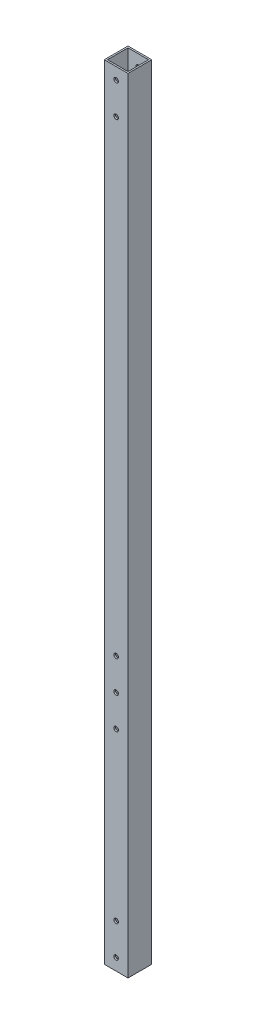
ISO-10303-21;
HEADER;
FILE_DESCRIPTION(('STEP AP214'),'2;1');
FILE_NAME('part.step','',(''),(''),'','','');
FILE_SCHEMA(('AUTOMOTIVE_DESIGN { 1 0 10303 214 1 1 1 1 }'));
ENDSEC;
DATA;
#1=APPLICATION_CONTEXT('core data for automotive mechanical design processes');
#2=APPLICATION_PROTOCOL_DEFINITION('international standard','automotive_design',2000,#1);
#3=PRODUCT_CONTEXT('',#1,'mechanical');
#4=PRODUCT('Part','Part','',(#3));
#5=PRODUCT_RELATED_PRODUCT_CATEGORY('part','',(#4));
#6=PRODUCT_DEFINITION_FORMATION('','',#4);
#7=PRODUCT_DEFINITION_CONTEXT('part definition',#1,'design');
#8=PRODUCT_DEFINITION('design','',#6,#7);
#9=PRODUCT_DEFINITION_SHAPE('','',#8);
#10=(LENGTH_UNIT() NAMED_UNIT(*) SI_UNIT(.MILLI.,.METRE.));
#11=(NAMED_UNIT(*) PLANE_ANGLE_UNIT() SI_UNIT($,.RADIAN.));
#12=(NAMED_UNIT(*) SI_UNIT($,.STERADIAN.) SOLID_ANGLE_UNIT());
#13=UNCERTAINTY_MEASURE_WITH_UNIT(LENGTH_MEASURE(1.E-05),#10,'distance_accuracy_value','');
#14=(GEOMETRIC_REPRESENTATION_CONTEXT(3) GLOBAL_UNCERTAINTY_ASSIGNED_CONTEXT((#13)) GLOBAL_UNIT_ASSIGNED_CONTEXT((#10,
#11,#12)) REPRESENTATION_CONTEXT('',''));
#15=CARTESIAN_POINT('',(0.,0.,0.));
#16=DIRECTION('',(0.,0.,1.));
#17=DIRECTION('',(1.,0.,0.));
#18=AXIS2_PLACEMENT_3D('',#15,#16,#17);
#19=CARTESIAN_POINT('',(0.,495.,0.));
#20=DIRECTION('',(0.,1.,0.));
#21=DIRECTION('',(0.,0.,1.));
#22=AXIS2_PLACEMENT_3D('',#19,#20,#21);
#23=PLANE('',#22);
#24=DIRECTION('',(0.,0.,-1.));
#25=VECTOR('',#24,1.);
#26=CARTESIAN_POINT('',(7.5,495.,7.5));
#27=LINE('',#26,#25);
#28=CARTESIAN_POINT('',(7.5,495.,7.5));
#29=VERTEX_POINT('',#28);
#30=CARTESIAN_POINT('',(7.5,495.,-7.5));
#31=VERTEX_POINT('',#30);
#32=EDGE_CURVE('E194',#29,#31,#27,.T.);
#33=ORIENTED_EDGE('',*,*,#32,.T.);
#34=DIRECTION('',(-1.,0.,0.));
#35=VECTOR('',#34,1.);
#36=CARTESIAN_POINT('',(-7.5,495.,-7.5));
#37=LINE('',#36,#35);
#38=CARTESIAN_POINT('',(-7.5,495.,-7.5));
#39=VERTEX_POINT('',#38);
#40=EDGE_CURVE('E198',#31,#39,#37,.T.);
#41=ORIENTED_EDGE('',*,*,#40,.T.);
#42=DIRECTION('',(0.,0.,1.));
#43=VECTOR('',#42,1.);
#44=CARTESIAN_POINT('',(-7.5,495.,7.5));
#45=LINE('',#44,#43);
#46=CARTESIAN_POINT('',(-7.5,495.,7.5));
#47=VERTEX_POINT('',#46);
#48=EDGE_CURVE('E202',#39,#47,#45,.T.);
#49=ORIENTED_EDGE('',*,*,#48,.T.);
#50=DIRECTION('',(1.,0.,0.));
#51=VECTOR('',#50,1.);
#52=CARTESIAN_POINT('',(-7.5,495.,7.5));
#53=LINE('',#52,#51);
#54=EDGE_CURVE('E205',#47,#29,#53,.T.);
#55=ORIENTED_EDGE('',*,*,#54,.T.);
#56=EDGE_LOOP('',(#33,#41,#49,#55));
#57=FACE_BOUND('',#56,.T.);
#58=DIRECTION('',(-1.,0.,0.));
#59=VECTOR('',#58,1.);
#60=CARTESIAN_POINT('',(0.,495.,-6.5));
#61=LINE('',#60,#59);
#62=CARTESIAN_POINT('',(6.5,495.,-6.5));
#63=VERTEX_POINT('',#62);
#64=CARTESIAN_POINT('',(-6.5,495.,-6.5));
#65=VERTEX_POINT('',#64);
#66=EDGE_CURVE('E150',#63,#65,#61,.T.);
#67=ORIENTED_EDGE('',*,*,#66,.F.);
#68=DIRECTION('',(0.,0.,-1.));
#69=VECTOR('',#68,1.);
#70=CARTESIAN_POINT('',(6.5,495.,0.));
#71=LINE('',#70,#69);
#72=CARTESIAN_POINT('',(6.5,495.,6.5));
#73=VERTEX_POINT('',#72);
#74=EDGE_CURVE('E141',#73,#63,#71,.T.);
#75=ORIENTED_EDGE('',*,*,#74,.F.);
#76=DIRECTION('',(1.,0.,0.));
#77=VECTOR('',#76,1.);
#78=CARTESIAN_POINT('',(0.,495.,6.5));
#79=LINE('',#78,#77);
#80=CARTESIAN_POINT('',(-6.5,495.,6.5));
#81=VERTEX_POINT('',#80);
#82=EDGE_CURVE('E170',#81,#73,#79,.T.);
#83=ORIENTED_EDGE('',*,*,#82,.F.);
#84=DIRECTION('',(0.,0.,1.));
#85=VECTOR('',#84,1.);
#86=CARTESIAN_POINT('',(-6.5,495.,0.));
#87=LINE('',#86,#85);
#88=EDGE_CURVE('E163',#65,#81,#87,.T.);
#89=ORIENTED_EDGE('',*,*,#88,.F.);
#90=EDGE_LOOP('',(#67,#75,#83,#89));
#91=FACE_BOUND('',#90,.T.);
#92=ADVANCED_FACE('F73',(#57,#91),#23,.T.);
#93=CARTESIAN_POINT('',(0.,0.,0.));
#94=DIRECTION('',(0.,1.,0.));
#95=DIRECTION('',(0.,0.,1.));
#96=AXIS2_PLACEMENT_3D('',#93,#94,#95);
#97=PLANE('',#96);
#98=DIRECTION('',(0.,0.,-1.));
#99=VECTOR('',#98,1.);
#100=CARTESIAN_POINT('',(7.5,0.,7.5));
#101=LINE('',#100,#99);
#102=CARTESIAN_POINT('',(7.5,0.,7.5));
#103=VERTEX_POINT('',#102);
#104=CARTESIAN_POINT('',(7.5,0.,-7.5));
#105=VERTEX_POINT('',#104);
#106=EDGE_CURVE('E159',#103,#105,#101,.T.);
#107=ORIENTED_EDGE('',*,*,#106,.F.);
#108=DIRECTION('',(1.,0.,0.));
#109=VECTOR('',#108,1.);
#110=CARTESIAN_POINT('',(-7.5,0.,7.5));
#111=LINE('',#110,#109);
#112=CARTESIAN_POINT('',(-7.5,0.,7.5));
#113=VERTEX_POINT('',#112);
#114=EDGE_CURVE('E199',#113,#103,#111,.T.);
#115=ORIENTED_EDGE('',*,*,#114,.F.);
#116=DIRECTION('',(0.,0.,1.));
#117=VECTOR('',#116,1.);
#118=CARTESIAN_POINT('',(-7.5,0.,7.5));
#119=LINE('',#118,#117);
#120=CARTESIAN_POINT('',(-7.5,0.,-7.5));
#121=VERTEX_POINT('',#120);
#122=EDGE_CURVE('E215',#121,#113,#119,.T.);
#123=ORIENTED_EDGE('',*,*,#122,.F.);
#124=DIRECTION('',(-1.,0.,0.));
#125=VECTOR('',#124,1.);
#126=CARTESIAN_POINT('',(-7.5,0.,-7.5));
#127=LINE('',#126,#125);
#128=EDGE_CURVE('E212',#105,#121,#127,.T.);
#129=ORIENTED_EDGE('',*,*,#128,.F.);
#130=EDGE_LOOP('',(#107,#115,#123,#129));
#131=FACE_BOUND('',#130,.T.);
#132=DIRECTION('',(0.,0.,-1.));
#133=VECTOR('',#132,1.);
#134=CARTESIAN_POINT('',(6.5,0.,0.));
#135=LINE('',#134,#133);
#136=CARTESIAN_POINT('',(6.5,0.,6.5));
#137=VERTEX_POINT('',#136);
#138=CARTESIAN_POINT('',(6.5,0.,-6.5));
#139=VERTEX_POINT('',#138);
#140=EDGE_CURVE('E99',#137,#139,#135,.T.);
#141=ORIENTED_EDGE('',*,*,#140,.T.);
#142=DIRECTION('',(-1.,0.,0.));
#143=VECTOR('',#142,1.);
#144=CARTESIAN_POINT('',(0.,0.,-6.5));
#145=LINE('',#144,#143);
#146=CARTESIAN_POINT('',(-6.5,0.,-6.5));
#147=VERTEX_POINT('',#146);
#148=EDGE_CURVE('E157',#139,#147,#145,.T.);
#149=ORIENTED_EDGE('',*,*,#148,.T.);
#150=DIRECTION('',(0.,0.,1.));
#151=VECTOR('',#150,1.);
#152=CARTESIAN_POINT('',(-6.5,0.,0.));
#153=LINE('',#152,#151);
#154=CARTESIAN_POINT('',(-6.5,0.,6.5));
#155=VERTEX_POINT('',#154);
#156=EDGE_CURVE('E181',#147,#155,#153,.T.);
#157=ORIENTED_EDGE('',*,*,#156,.T.);
#158=DIRECTION('',(1.,0.,0.));
#159=VECTOR('',#158,1.);
#160=CARTESIAN_POINT('',(0.,0.,6.5));
#161=LINE('',#160,#159);
#162=EDGE_CURVE('E151',#155,#137,#161,.T.);
#163=ORIENTED_EDGE('',*,*,#162,.T.);
#164=EDGE_LOOP('',(#141,#149,#157,#163));
#165=FACE_BOUND('',#164,.T.);
#166=ADVANCED_FACE('F307',(#131,#165),#97,.F.);
#167=CARTESIAN_POINT('',(7.5,495.,7.5));
#168=DIRECTION('',(-1.,0.,0.));
#169=DIRECTION('',(0.,0.,1.));
#170=AXIS2_PLACEMENT_3D('',#167,#168,#169);
#171=PLANE('',#170);
#172=ORIENTED_EDGE('',*,*,#106,.T.);
#173=DIRECTION('',(0.,-1.,0.));
#174=VECTOR('',#173,1.);
#175=CARTESIAN_POINT('',(7.5,495.,-7.5));
#176=LINE('',#175,#174);
#177=EDGE_CURVE('E12',#31,#105,#176,.T.);
#178=ORIENTED_EDGE('',*,*,#177,.F.);
#179=ORIENTED_EDGE('',*,*,#32,.F.);
#180=DIRECTION('',(0.,-1.,0.));
#181=VECTOR('',#180,1.);
#182=CARTESIAN_POINT('',(7.5,495.,7.5));
#183=LINE('',#182,#181);
#184=EDGE_CURVE('E208',#29,#103,#183,.T.);
#185=ORIENTED_EDGE('',*,*,#184,.T.);
#186=EDGE_LOOP('',(#172,#178,#179,#185));
#187=FACE_BOUND('',#186,.T.);
#188=ADVANCED_FACE('F75',(#187),#171,.F.);
#189=CARTESIAN_POINT('',(-7.5,495.,-7.5));
#190=DIRECTION('',(0.,0.,1.));
#191=DIRECTION('',(1.,0.,0.));
#192=AXIS2_PLACEMENT_3D('',#189,#190,#191);
#193=PLANE('',#192);
#194=CARTESIAN_POINT('',(0.,487.5,-7.5));
#195=DIRECTION('',(0.,0.,1.));
#196=DIRECTION('',(1.,0.,0.));
#197=AXIS2_PLACEMENT_3D('',#194,#195,#196);
#198=CIRCLE('',#197,1.44999999999998);
#199=CARTESIAN_POINT('',(1.44999999999998,487.5,-7.5));
#200=VERTEX_POINT('',#199);
#201=EDGE_CURVE('E235',#200,#200,#198,.T.);
#202=ORIENTED_EDGE('',*,*,#201,.T.);
#203=EDGE_LOOP('',(#202));
#204=FACE_BOUND('',#203,.T.);
#205=CARTESIAN_POINT('',(0.,132.5,-7.5));
#206=DIRECTION('',(0.,0.,1.));
#207=DIRECTION('',(1.,0.,0.));
#208=AXIS2_PLACEMENT_3D('',#205,#206,#207);
#209=CIRCLE('',#208,1.45000000000001);
#210=CARTESIAN_POINT('',(1.45000000000001,132.5,-7.5));
#211=VERTEX_POINT('',#210);
#212=EDGE_CURVE('E343',#211,#211,#209,.T.);
#213=ORIENTED_EDGE('',*,*,#212,.T.);
#214=EDGE_LOOP('',(#213));
#215=FACE_BOUND('',#214,.T.);
#216=CARTESIAN_POINT('',(0.,172.5,-7.5));
#217=DIRECTION('',(0.,0.,1.));
#218=DIRECTION('',(1.,0.,0.));
#219=AXIS2_PLACEMENT_3D('',#216,#217,#218);
#220=CIRCLE('',#219,1.45000000000001);
#221=CARTESIAN_POINT('',(1.45000000000001,172.5,-7.5));
#222=VERTEX_POINT('',#221);
#223=EDGE_CURVE('E347',#222,#222,#220,.T.);
#224=ORIENTED_EDGE('',*,*,#223,.T.);
#225=EDGE_LOOP('',(#224));
#226=FACE_BOUND('',#225,.T.);
#227=CARTESIAN_POINT('',(0.,467.5,-7.5));
#228=DIRECTION('',(0.,0.,1.));
#229=DIRECTION('',(1.,0.,0.));
#230=AXIS2_PLACEMENT_3D('',#227,#228,#229);
#231=CIRCLE('',#230,1.44999999999998);
#232=CARTESIAN_POINT('',(1.44999999999998,467.5,-7.5));
#233=VERTEX_POINT('',#232);
#234=EDGE_CURVE('E351',#233,#233,#231,.T.);
#235=ORIENTED_EDGE('',*,*,#234,.T.);
#236=EDGE_LOOP('',(#235));
#237=FACE_BOUND('',#236,.T.);
#238=CARTESIAN_POINT('',(0.,27.5,-7.5));
#239=DIRECTION('',(0.,0.,1.));
#240=DIRECTION('',(1.,0.,0.));
#241=AXIS2_PLACEMENT_3D('',#238,#239,#240);
#242=CIRCLE('',#241,1.45);
#243=CARTESIAN_POINT('',(1.45,27.5,-7.5));
#244=VERTEX_POINT('',#243);
#245=EDGE_CURVE('E355',#244,#244,#242,.T.);
#246=ORIENTED_EDGE('',*,*,#245,.T.);
#247=EDGE_LOOP('',(#246));
#248=FACE_BOUND('',#247,.T.);
#249=CARTESIAN_POINT('',(0.,7.5,-7.5));
#250=DIRECTION('',(0.,0.,1.));
#251=DIRECTION('',(1.,0.,0.));
#252=AXIS2_PLACEMENT_3D('',#249,#250,#251);
#253=CIRCLE('',#252,1.45);
#254=CARTESIAN_POINT('',(1.45,7.5,-7.5));
#255=VERTEX_POINT('',#254);
#256=EDGE_CURVE('E359',#255,#255,#253,.T.);
#257=ORIENTED_EDGE('',*,*,#256,.T.);
#258=EDGE_LOOP('',(#257));
#259=FACE_BOUND('',#258,.T.);
#260=CARTESIAN_POINT('',(0.,152.5,-7.5));
#261=DIRECTION('',(0.,0.,1.));
#262=DIRECTION('',(1.,0.,0.));
#263=AXIS2_PLACEMENT_3D('',#260,#261,#262);
#264=CIRCLE('',#263,1.45);
#265=CARTESIAN_POINT('',(1.45,152.5,-7.5));
#266=VERTEX_POINT('',#265);
#267=EDGE_CURVE('E363',#266,#266,#264,.T.);
#268=ORIENTED_EDGE('',*,*,#267,.T.);
#269=EDGE_LOOP('',(#268));
#270=FACE_BOUND('',#269,.T.);
#271=ORIENTED_EDGE('',*,*,#128,.T.);
#272=DIRECTION('',(0.,-1.,0.));
#273=VECTOR('',#272,1.);
#274=CARTESIAN_POINT('',(-7.5,495.,-7.5));
#275=LINE('',#274,#273);
#276=EDGE_CURVE('E83',#39,#121,#275,.T.);
#277=ORIENTED_EDGE('',*,*,#276,.F.);
#278=ORIENTED_EDGE('',*,*,#40,.F.);
#279=ORIENTED_EDGE('',*,*,#177,.T.);
#280=EDGE_LOOP('',(#271,#277,#278,#279));
#281=FACE_BOUND('',#280,.T.);
#282=ADVANCED_FACE('F330',(#204,#215,#226,#237,#248,#259,#270,#281),#193,.F.);
#283=CARTESIAN_POINT('',(-7.5,495.,7.5));
#284=DIRECTION('',(1.,0.,0.));
#285=DIRECTION('',(0.,0.,-1.));
#286=AXIS2_PLACEMENT_3D('',#283,#284,#285);
#287=PLANE('',#286);
#288=ORIENTED_EDGE('',*,*,#122,.T.);
#289=DIRECTION('',(0.,-1.,0.));
#290=VECTOR('',#289,1.);
#291=CARTESIAN_POINT('',(-7.5,495.,7.5));
#292=LINE('',#291,#290);
#293=EDGE_CURVE('E223',#47,#113,#292,.T.);
#294=ORIENTED_EDGE('',*,*,#293,.F.);
#295=ORIENTED_EDGE('',*,*,#48,.F.);
#296=ORIENTED_EDGE('',*,*,#276,.T.);
#297=EDGE_LOOP('',(#288,#294,#295,#296));
#298=FACE_BOUND('',#297,.T.);
#299=ADVANCED_FACE('F327',(#298),#287,.F.);
#300=CARTESIAN_POINT('',(-7.5,495.,7.5));
#301=DIRECTION('',(0.,0.,-1.));
#302=DIRECTION('',(-1.,0.,0.));
#303=AXIS2_PLACEMENT_3D('',#300,#301,#302);
#304=PLANE('',#303);
#305=CARTESIAN_POINT('',(0.,487.5,7.5));
#306=DIRECTION('',(0.,0.,1.));
#307=DIRECTION('',(1.,0.,0.));
#308=AXIS2_PLACEMENT_3D('',#305,#306,#307);
#309=CIRCLE('',#308,1.44999999999998);
#310=CARTESIAN_POINT('',(1.44999999999998,487.5,7.5));
#311=VERTEX_POINT('',#310);
#312=EDGE_CURVE('E392',#311,#311,#309,.T.);
#313=ORIENTED_EDGE('',*,*,#312,.F.);
#314=EDGE_LOOP('',(#313));
#315=FACE_BOUND('',#314,.T.);
#316=CARTESIAN_POINT('',(0.,132.5,7.5));
#317=DIRECTION('',(0.,0.,1.));
#318=DIRECTION('',(1.,0.,0.));
#319=AXIS2_PLACEMENT_3D('',#316,#317,#318);
#320=CIRCLE('',#319,1.45000000000001);
#321=CARTESIAN_POINT('',(1.45000000000001,132.5,7.5));
#322=VERTEX_POINT('',#321);
#323=EDGE_CURVE('E468',#322,#322,#320,.T.);
#324=ORIENTED_EDGE('',*,*,#323,.F.);
#325=EDGE_LOOP('',(#324));
#326=FACE_BOUND('',#325,.T.);
#327=CARTESIAN_POINT('',(0.,172.5,7.5));
#328=DIRECTION('',(0.,0.,1.));
#329=DIRECTION('',(1.,0.,0.));
#330=AXIS2_PLACEMENT_3D('',#327,#328,#329);
#331=CIRCLE('',#330,1.45000000000001);
#332=CARTESIAN_POINT('',(1.45000000000001,172.5,7.5));
#333=VERTEX_POINT('',#332);
#334=EDGE_CURVE('E377',#333,#333,#331,.T.);
#335=ORIENTED_EDGE('',*,*,#334,.F.);
#336=EDGE_LOOP('',(#335));
#337=FACE_BOUND('',#336,.T.);
#338=CARTESIAN_POINT('',(0.,467.5,7.5));
#339=DIRECTION('',(0.,0.,1.));
#340=DIRECTION('',(1.,0.,0.));
#341=AXIS2_PLACEMENT_3D('',#338,#339,#340);
#342=CIRCLE('',#341,1.44999999999998);
#343=CARTESIAN_POINT('',(1.44999999999998,467.5,7.5));
#344=VERTEX_POINT('',#343);
#345=EDGE_CURVE('E388',#344,#344,#342,.T.);
#346=ORIENTED_EDGE('',*,*,#345,.F.);
#347=EDGE_LOOP('',(#346));
#348=FACE_BOUND('',#347,.T.);
#349=CARTESIAN_POINT('',(0.,27.5,7.5));
#350=DIRECTION('',(0.,0.,1.));
#351=DIRECTION('',(1.,0.,0.));
#352=AXIS2_PLACEMENT_3D('',#349,#350,#351);
#353=CIRCLE('',#352,1.45);
#354=CARTESIAN_POINT('',(1.45,27.5,7.5));
#355=VERTEX_POINT('',#354);
#356=EDGE_CURVE('E394',#355,#355,#353,.T.);
#357=ORIENTED_EDGE('',*,*,#356,.F.);
#358=EDGE_LOOP('',(#357));
#359=FACE_BOUND('',#358,.T.);
#360=CARTESIAN_POINT('',(0.,7.5,7.5));
#361=DIRECTION('',(0.,0.,1.));
#362=DIRECTION('',(1.,0.,0.));
#363=AXIS2_PLACEMENT_3D('',#360,#361,#362);
#364=CIRCLE('',#363,1.45);
#365=CARTESIAN_POINT('',(1.45,7.5,7.5));
#366=VERTEX_POINT('',#365);
#367=EDGE_CURVE('E399',#366,#366,#364,.T.);
#368=ORIENTED_EDGE('',*,*,#367,.F.);
#369=EDGE_LOOP('',(#368));
#370=FACE_BOUND('',#369,.T.);
#371=CARTESIAN_POINT('',(0.,152.5,7.5));
#372=DIRECTION('',(0.,0.,1.));
#373=DIRECTION('',(1.,0.,0.));
#374=AXIS2_PLACEMENT_3D('',#371,#372,#373);
#375=CIRCLE('',#374,1.45);
#376=CARTESIAN_POINT('',(1.45,152.5,7.5));
#377=VERTEX_POINT('',#376);
#378=EDGE_CURVE('E376',#377,#377,#375,.T.);
#379=ORIENTED_EDGE('',*,*,#378,.F.);
#380=EDGE_LOOP('',(#379));
#381=FACE_BOUND('',#380,.T.);
#382=ORIENTED_EDGE('',*,*,#114,.T.);
#383=ORIENTED_EDGE('',*,*,#184,.F.);
#384=ORIENTED_EDGE('',*,*,#54,.F.);
#385=ORIENTED_EDGE('',*,*,#293,.T.);
#386=EDGE_LOOP('',(#382,#383,#384,#385));
#387=FACE_BOUND('',#386,.T.);
#388=ADVANCED_FACE('F324',(#315,#326,#337,#348,#359,#370,#381,#387),#304,.F.);
#389=CARTESIAN_POINT('',(6.5,495.,0.));
#390=DIRECTION('',(-1.,0.,0.));
#391=DIRECTION('',(0.,0.,1.));
#392=AXIS2_PLACEMENT_3D('',#389,#390,#391);
#393=PLANE('',#392);
#394=ORIENTED_EDGE('',*,*,#140,.F.);
#395=DIRECTION('',(0.,-1.,0.));
#396=VECTOR('',#395,1.);
#397=CARTESIAN_POINT('',(6.5,495.,6.5));
#398=LINE('',#397,#396);
#399=EDGE_CURVE('E145',#73,#137,#398,.T.);
#400=ORIENTED_EDGE('',*,*,#399,.F.);
#401=ORIENTED_EDGE('',*,*,#74,.T.);
#402=DIRECTION('',(0.,-1.,0.));
#403=VECTOR('',#402,1.);
#404=CARTESIAN_POINT('',(6.5,495.,-6.5));
#405=LINE('',#404,#403);
#406=EDGE_CURVE('E144',#63,#139,#405,.T.);
#407=ORIENTED_EDGE('',*,*,#406,.T.);
#408=EDGE_LOOP('',(#394,#400,#401,#407));
#409=FACE_BOUND('',#408,.T.);
#410=ADVANCED_FACE('F143',(#409),#393,.T.);
#411=CARTESIAN_POINT('',(0.,495.,-6.5));
#412=DIRECTION('',(0.,0.,1.));
#413=DIRECTION('',(1.,0.,0.));
#414=AXIS2_PLACEMENT_3D('',#411,#412,#413);
#415=PLANE('',#414);
#416=CARTESIAN_POINT('',(0.,487.5,-6.5));
#417=DIRECTION('',(0.,0.,1.));
#418=DIRECTION('',(1.,0.,0.));
#419=AXIS2_PLACEMENT_3D('',#416,#417,#418);
#420=CIRCLE('',#419,1.44999999999998);
#421=CARTESIAN_POINT('',(1.44999999999998,487.5,-6.5));
#422=VERTEX_POINT('',#421);
#423=EDGE_CURVE('E178',#422,#422,#420,.T.);
#424=ORIENTED_EDGE('',*,*,#423,.F.);
#425=EDGE_LOOP('',(#424));
#426=FACE_BOUND('',#425,.T.);
#427=CARTESIAN_POINT('',(0.,132.5,-6.5));
#428=DIRECTION('',(0.,0.,1.));
#429=DIRECTION('',(1.,0.,0.));
#430=AXIS2_PLACEMENT_3D('',#427,#428,#429);
#431=CIRCLE('',#430,1.45000000000001);
#432=CARTESIAN_POINT('',(1.45000000000001,132.5,-6.5));
#433=VERTEX_POINT('',#432);
#434=EDGE_CURVE('E258',#433,#433,#431,.T.);
#435=ORIENTED_EDGE('',*,*,#434,.F.);
#436=EDGE_LOOP('',(#435));
#437=FACE_BOUND('',#436,.T.);
#438=CARTESIAN_POINT('',(0.,172.5,-6.5));
#439=DIRECTION('',(0.,0.,1.));
#440=DIRECTION('',(1.,0.,0.));
#441=AXIS2_PLACEMENT_3D('',#438,#439,#440);
#442=CIRCLE('',#441,1.45000000000001);
#443=CARTESIAN_POINT('',(1.45000000000001,172.5,-6.5));
#444=VERTEX_POINT('',#443);
#445=EDGE_CURVE('E254',#444,#444,#442,.T.);
#446=ORIENTED_EDGE('',*,*,#445,.F.);
#447=EDGE_LOOP('',(#446));
#448=FACE_BOUND('',#447,.T.);
#449=CARTESIAN_POINT('',(0.,467.5,-6.5));
#450=DIRECTION('',(0.,0.,1.));
#451=DIRECTION('',(1.,0.,0.));
#452=AXIS2_PLACEMENT_3D('',#449,#450,#451);
#453=CIRCLE('',#452,1.44999999999998);
#454=CARTESIAN_POINT('',(1.44999999999998,467.5,-6.5));
#455=VERTEX_POINT('',#454);
#456=EDGE_CURVE('E250',#455,#455,#453,.T.);
#457=ORIENTED_EDGE('',*,*,#456,.F.);
#458=EDGE_LOOP('',(#457));
#459=FACE_BOUND('',#458,.T.);
#460=CARTESIAN_POINT('',(0.,27.5,-6.5));
#461=DIRECTION('',(0.,0.,1.));
#462=DIRECTION('',(1.,0.,0.));
#463=AXIS2_PLACEMENT_3D('',#460,#461,#462);
#464=CIRCLE('',#463,1.45);
#465=CARTESIAN_POINT('',(1.45,27.5,-6.5));
#466=VERTEX_POINT('',#465);
#467=EDGE_CURVE('E245',#466,#466,#464,.T.);
#468=ORIENTED_EDGE('',*,*,#467,.F.);
#469=EDGE_LOOP('',(#468));
#470=FACE_BOUND('',#469,.T.);
#471=CARTESIAN_POINT('',(0.,7.5,-6.5));
#472=DIRECTION('',(0.,0.,1.));
#473=DIRECTION('',(1.,0.,0.));
#474=AXIS2_PLACEMENT_3D('',#471,#472,#473);
#475=CIRCLE('',#474,1.45);
#476=CARTESIAN_POINT('',(1.45,7.5,-6.5));
#477=VERTEX_POINT('',#476);
#478=EDGE_CURVE('E240',#477,#477,#475,.T.);
#479=ORIENTED_EDGE('',*,*,#478,.F.);
#480=EDGE_LOOP('',(#479));
#481=FACE_BOUND('',#480,.T.);
#482=CARTESIAN_POINT('',(0.,152.5,-6.5));
#483=DIRECTION('',(0.,0.,1.));
#484=DIRECTION('',(1.,0.,0.));
#485=AXIS2_PLACEMENT_3D('',#482,#483,#484);
#486=CIRCLE('',#485,1.45);
#487=CARTESIAN_POINT('',(1.45,152.5,-6.5));
#488=VERTEX_POINT('',#487);
#489=EDGE_CURVE('E234',#488,#488,#486,.T.);
#490=ORIENTED_EDGE('',*,*,#489,.F.);
#491=EDGE_LOOP('',(#490));
#492=FACE_BOUND('',#491,.T.);
#493=ORIENTED_EDGE('',*,*,#148,.F.);
#494=ORIENTED_EDGE('',*,*,#406,.F.);
#495=ORIENTED_EDGE('',*,*,#66,.T.);
#496=DIRECTION('',(0.,-1.,0.));
#497=VECTOR('',#496,1.);
#498=CARTESIAN_POINT('',(-6.5,495.,-6.5));
#499=LINE('',#498,#497);
#500=EDGE_CURVE('E160',#65,#147,#499,.T.);
#501=ORIENTED_EDGE('',*,*,#500,.T.);
#502=EDGE_LOOP('',(#493,#494,#495,#501));
#503=FACE_BOUND('',#502,.T.);
#504=ADVANCED_FACE('F154',(#426,#437,#448,#459,#470,#481,#492,#503),#415,.T.);
#505=CARTESIAN_POINT('',(-6.5,495.,0.));
#506=DIRECTION('',(1.,0.,0.));
#507=DIRECTION('',(0.,0.,-1.));
#508=AXIS2_PLACEMENT_3D('',#505,#506,#507);
#509=PLANE('',#508);
#510=ORIENTED_EDGE('',*,*,#156,.F.);
#511=ORIENTED_EDGE('',*,*,#500,.F.);
#512=ORIENTED_EDGE('',*,*,#88,.T.);
#513=DIRECTION('',(0.,-1.,0.));
#514=VECTOR('',#513,1.);
#515=CARTESIAN_POINT('',(-6.5,495.,6.5));
#516=LINE('',#515,#514);
#517=EDGE_CURVE('E91',#81,#155,#516,.T.);
#518=ORIENTED_EDGE('',*,*,#517,.T.);
#519=EDGE_LOOP('',(#510,#511,#512,#518));
#520=FACE_BOUND('',#519,.T.);
#521=ADVANCED_FACE('F293',(#520),#509,.T.);
#522=CARTESIAN_POINT('',(0.,495.,6.5));
#523=DIRECTION('',(0.,0.,-1.));
#524=DIRECTION('',(-1.,0.,0.));
#525=AXIS2_PLACEMENT_3D('',#522,#523,#524);
#526=PLANE('',#525);
#527=CARTESIAN_POINT('',(0.,487.5,6.5));
#528=DIRECTION('',(0.,0.,-1.));
#529=DIRECTION('',(-1.,0.,0.));
#530=AXIS2_PLACEMENT_3D('',#527,#528,#529);
#531=CIRCLE('',#530,1.44999999999998);
#532=CARTESIAN_POINT('',(-1.44999999999998,487.5,6.5));
#533=VERTEX_POINT('',#532);
#534=EDGE_CURVE('E77',#533,#533,#531,.T.);
#535=ORIENTED_EDGE('',*,*,#534,.F.);
#536=EDGE_LOOP('',(#535));
#537=FACE_BOUND('',#536,.T.);
#538=CARTESIAN_POINT('',(0.,132.5,6.5));
#539=DIRECTION('',(0.,0.,-1.));
#540=DIRECTION('',(-1.,0.,0.));
#541=AXIS2_PLACEMENT_3D('',#538,#539,#540);
#542=CIRCLE('',#541,1.45000000000001);
#543=CARTESIAN_POINT('',(-1.45000000000001,132.5,6.5));
#544=VERTEX_POINT('',#543);
#545=EDGE_CURVE('E255',#544,#544,#542,.T.);
#546=ORIENTED_EDGE('',*,*,#545,.F.);
#547=EDGE_LOOP('',(#546));
#548=FACE_BOUND('',#547,.T.);
#549=CARTESIAN_POINT('',(0.,172.5,6.5));
#550=DIRECTION('',(0.,0.,-1.));
#551=DIRECTION('',(-1.,0.,0.));
#552=AXIS2_PLACEMENT_3D('',#549,#550,#551);
#553=CIRCLE('',#552,1.45000000000001);
#554=CARTESIAN_POINT('',(-1.45000000000001,172.5,6.5));
#555=VERTEX_POINT('',#554);
#556=EDGE_CURVE('E251',#555,#555,#553,.T.);
#557=ORIENTED_EDGE('',*,*,#556,.F.);
#558=EDGE_LOOP('',(#557));
#559=FACE_BOUND('',#558,.T.);
#560=CARTESIAN_POINT('',(0.,467.5,6.5));
#561=DIRECTION('',(0.,0.,-1.));
#562=DIRECTION('',(-1.,0.,0.));
#563=AXIS2_PLACEMENT_3D('',#560,#561,#562);
#564=CIRCLE('',#563,1.44999999999998);
#565=CARTESIAN_POINT('',(-1.44999999999998,467.5,6.5));
#566=VERTEX_POINT('',#565);
#567=EDGE_CURVE('E246',#566,#566,#564,.T.);
#568=ORIENTED_EDGE('',*,*,#567,.F.);
#569=EDGE_LOOP('',(#568));
#570=FACE_BOUND('',#569,.T.);
#571=CARTESIAN_POINT('',(0.,27.5,6.5));
#572=DIRECTION('',(0.,0.,-1.));
#573=DIRECTION('',(-1.,0.,0.));
#574=AXIS2_PLACEMENT_3D('',#571,#572,#573);
#575=CIRCLE('',#574,1.45);
#576=CARTESIAN_POINT('',(-1.45,27.5,6.5));
#577=VERTEX_POINT('',#576);
#578=EDGE_CURVE('E241',#577,#577,#575,.T.);
#579=ORIENTED_EDGE('',*,*,#578,.F.);
#580=EDGE_LOOP('',(#579));
#581=FACE_BOUND('',#580,.T.);
#582=CARTESIAN_POINT('',(0.,7.5,6.5));
#583=DIRECTION('',(0.,0.,-1.));
#584=DIRECTION('',(-1.,0.,0.));
#585=AXIS2_PLACEMENT_3D('',#582,#583,#584);
#586=CIRCLE('',#585,1.45);
#587=CARTESIAN_POINT('',(-1.45,7.5,6.5));
#588=VERTEX_POINT('',#587);
#589=EDGE_CURVE('E236',#588,#588,#586,.T.);
#590=ORIENTED_EDGE('',*,*,#589,.F.);
#591=EDGE_LOOP('',(#590));
#592=FACE_BOUND('',#591,.T.);
#593=CARTESIAN_POINT('',(0.,152.5,6.5));
#594=DIRECTION('',(0.,0.,-1.));
#595=DIRECTION('',(-1.,0.,0.));
#596=AXIS2_PLACEMENT_3D('',#593,#594,#595);
#597=CIRCLE('',#596,1.45);
#598=CARTESIAN_POINT('',(-1.45,152.5,6.5));
#599=VERTEX_POINT('',#598);
#600=EDGE_CURVE('E230',#599,#599,#597,.T.);
#601=ORIENTED_EDGE('',*,*,#600,.F.);
#602=EDGE_LOOP('',(#601));
#603=FACE_BOUND('',#602,.T.);
#604=ORIENTED_EDGE('',*,*,#162,.F.);
#605=ORIENTED_EDGE('',*,*,#517,.F.);
#606=ORIENTED_EDGE('',*,*,#82,.T.);
#607=ORIENTED_EDGE('',*,*,#399,.T.);
#608=EDGE_LOOP('',(#604,#605,#606,#607));
#609=FACE_BOUND('',#608,.T.);
#610=ADVANCED_FACE('F289',(#537,#548,#559,#570,#581,#592,#603,#609),#526,.T.);
#611=CARTESIAN_POINT('',(0.,152.5,-7.5));
#612=DIRECTION('',(0.,0.,1.));
#613=DIRECTION('',(1.,0.,0.));
#614=AXIS2_PLACEMENT_3D('',#611,#612,#613);
#615=CYLINDRICAL_SURFACE('',#614,1.45);
#616=ORIENTED_EDGE('',*,*,#600,.T.);
#617=EDGE_LOOP('',(#616));
#618=FACE_BOUND('',#617,.T.);
#619=ORIENTED_EDGE('',*,*,#378,.T.);
#620=EDGE_LOOP('',(#619));
#621=FACE_BOUND('',#620,.T.);
#622=ADVANCED_FACE('F292',(#618,#621),#615,.F.);
#623=CARTESIAN_POINT('',(0.,7.5,-7.5));
#624=DIRECTION('',(0.,0.,1.));
#625=DIRECTION('',(1.,0.,0.));
#626=AXIS2_PLACEMENT_3D('',#623,#624,#625);
#627=CYLINDRICAL_SURFACE('',#626,1.45);
#628=ORIENTED_EDGE('',*,*,#589,.T.);
#629=EDGE_LOOP('',(#628));
#630=FACE_BOUND('',#629,.T.);
#631=ORIENTED_EDGE('',*,*,#367,.T.);
#632=EDGE_LOOP('',(#631));
#633=FACE_BOUND('',#632,.T.);
#634=ADVANCED_FACE('F427',(#630,#633),#627,.F.);
#635=CARTESIAN_POINT('',(0.,27.5,-7.5));
#636=DIRECTION('',(0.,0.,1.));
#637=DIRECTION('',(1.,0.,0.));
#638=AXIS2_PLACEMENT_3D('',#635,#636,#637);
#639=CYLINDRICAL_SURFACE('',#638,1.45);
#640=ORIENTED_EDGE('',*,*,#578,.T.);
#641=EDGE_LOOP('',(#640));
#642=FACE_BOUND('',#641,.T.);
#643=ORIENTED_EDGE('',*,*,#356,.T.);
#644=EDGE_LOOP('',(#643));
#645=FACE_BOUND('',#644,.T.);
#646=ADVANCED_FACE('F436',(#642,#645),#639,.F.);
#647=CARTESIAN_POINT('',(0.,467.5,-7.5));
#648=DIRECTION('',(0.,0.,1.));
#649=DIRECTION('',(1.,0.,0.));
#650=AXIS2_PLACEMENT_3D('',#647,#648,#649);
#651=CYLINDRICAL_SURFACE('',#650,1.44999999999998);
#652=ORIENTED_EDGE('',*,*,#567,.T.);
#653=EDGE_LOOP('',(#652));
#654=FACE_BOUND('',#653,.T.);
#655=ORIENTED_EDGE('',*,*,#345,.T.);
#656=EDGE_LOOP('',(#655));
#657=FACE_BOUND('',#656,.T.);
#658=ADVANCED_FACE('F443',(#654,#657),#651,.F.);
#659=CARTESIAN_POINT('',(0.,172.5,-7.5));
#660=DIRECTION('',(0.,0.,1.));
#661=DIRECTION('',(1.,0.,0.));
#662=AXIS2_PLACEMENT_3D('',#659,#660,#661);
#663=CYLINDRICAL_SURFACE('',#662,1.45000000000001);
#664=ORIENTED_EDGE('',*,*,#556,.T.);
#665=EDGE_LOOP('',(#664));
#666=FACE_BOUND('',#665,.T.);
#667=ORIENTED_EDGE('',*,*,#334,.T.);
#668=EDGE_LOOP('',(#667));
#669=FACE_BOUND('',#668,.T.);
#670=ADVANCED_FACE('F450',(#666,#669),#663,.F.);
#671=CARTESIAN_POINT('',(0.,132.5,-7.5));
#672=DIRECTION('',(0.,0.,1.));
#673=DIRECTION('',(1.,0.,0.));
#674=AXIS2_PLACEMENT_3D('',#671,#672,#673);
#675=CYLINDRICAL_SURFACE('',#674,1.45000000000001);
#676=ORIENTED_EDGE('',*,*,#545,.T.);
#677=EDGE_LOOP('',(#676));
#678=FACE_BOUND('',#677,.T.);
#679=ORIENTED_EDGE('',*,*,#323,.T.);
#680=EDGE_LOOP('',(#679));
#681=FACE_BOUND('',#680,.T.);
#682=ADVANCED_FACE('F428',(#678,#681),#675,.F.);
#683=CARTESIAN_POINT('',(0.,487.5,-7.5));
#684=DIRECTION('',(0.,0.,1.));
#685=DIRECTION('',(1.,0.,0.));
#686=AXIS2_PLACEMENT_3D('',#683,#684,#685);
#687=CYLINDRICAL_SURFACE('',#686,1.44999999999998);
#688=ORIENTED_EDGE('',*,*,#534,.T.);
#689=EDGE_LOOP('',(#688));
#690=FACE_BOUND('',#689,.T.);
#691=ORIENTED_EDGE('',*,*,#312,.T.);
#692=EDGE_LOOP('',(#691));
#693=FACE_BOUND('',#692,.T.);
#694=ADVANCED_FACE('F286',(#690,#693),#687,.F.);
#695=ORIENTED_EDGE('',*,*,#489,.T.);
#696=EDGE_LOOP('',(#695));
#697=FACE_BOUND('',#696,.T.);
#698=ORIENTED_EDGE('',*,*,#267,.F.);
#699=EDGE_LOOP('',(#698));
#700=FACE_BOUND('',#699,.T.);
#701=ADVANCED_FACE('F418',(#697,#700),#615,.F.);
#702=ORIENTED_EDGE('',*,*,#478,.T.);
#703=EDGE_LOOP('',(#702));
#704=FACE_BOUND('',#703,.T.);
#705=ORIENTED_EDGE('',*,*,#256,.F.);
#706=EDGE_LOOP('',(#705));
#707=FACE_BOUND('',#706,.T.);
#708=ADVANCED_FACE('F420',(#704,#707),#627,.F.);
#709=ORIENTED_EDGE('',*,*,#467,.T.);
#710=EDGE_LOOP('',(#709));
#711=FACE_BOUND('',#710,.T.);
#712=ORIENTED_EDGE('',*,*,#245,.F.);
#713=EDGE_LOOP('',(#712));
#714=FACE_BOUND('',#713,.T.);
#715=ADVANCED_FACE('F410',(#711,#714),#639,.F.);
#716=ORIENTED_EDGE('',*,*,#456,.T.);
#717=EDGE_LOOP('',(#716));
#718=FACE_BOUND('',#717,.T.);
#719=ORIENTED_EDGE('',*,*,#234,.F.);
#720=EDGE_LOOP('',(#719));
#721=FACE_BOUND('',#720,.T.);
#722=ADVANCED_FACE('F458',(#718,#721),#651,.F.);
#723=ORIENTED_EDGE('',*,*,#445,.T.);
#724=EDGE_LOOP('',(#723));
#725=FACE_BOUND('',#724,.T.);
#726=ORIENTED_EDGE('',*,*,#223,.F.);
#727=EDGE_LOOP('',(#726));
#728=FACE_BOUND('',#727,.T.);
#729=ADVANCED_FACE('F454',(#725,#728),#663,.F.);
#730=ORIENTED_EDGE('',*,*,#434,.T.);
#731=EDGE_LOOP('',(#730));
#732=FACE_BOUND('',#731,.T.);
#733=ORIENTED_EDGE('',*,*,#212,.F.);
#734=EDGE_LOOP('',(#733));
#735=FACE_BOUND('',#734,.T.);
#736=ADVANCED_FACE('F451',(#732,#735),#675,.F.);
#737=ORIENTED_EDGE('',*,*,#423,.T.);
#738=EDGE_LOOP('',(#737));
#739=FACE_BOUND('',#738,.T.);
#740=ORIENTED_EDGE('',*,*,#201,.F.);
#741=EDGE_LOOP('',(#740));
#742=FACE_BOUND('',#741,.T.);
#743=ADVANCED_FACE('F430',(#739,#742),#687,.F.);
#744=CLOSED_SHELL('',(#92,#166,#188,#282,#299,#388,#410,#504,#521,#610,#622,#634,#646,#658,#670,
#682,#694,#701,#708,#715,#722,#729,#736,#743));
#745=MANIFOLD_SOLID_BREP('B2',#744);
#746=ADVANCED_BREP_SHAPE_REPRESENTATION('',(#18,#745),#14);
#747=SHAPE_DEFINITION_REPRESENTATION(#9,#746);
ENDSEC;
END-ISO-10303-21;
